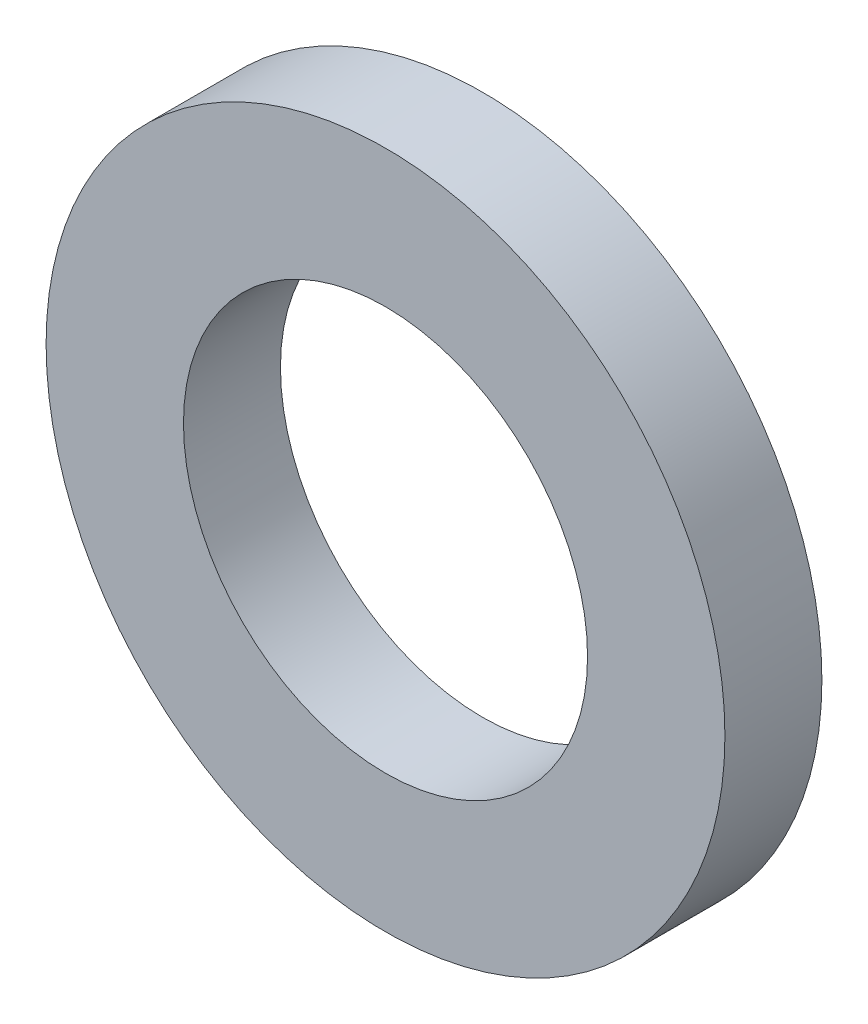
ISO-10303-21;
HEADER;
FILE_DESCRIPTION(('STEP AP214'),'2;1');
FILE_NAME('part.step','',(''),(''),'','','');
FILE_SCHEMA(('AUTOMOTIVE_DESIGN { 1 0 10303 214 1 1 1 1 }'));
ENDSEC;
DATA;
#1=APPLICATION_CONTEXT('core data for automotive mechanical design processes');
#2=APPLICATION_PROTOCOL_DEFINITION('international standard','automotive_design',2000,#1);
#3=PRODUCT_CONTEXT('',#1,'mechanical');
#4=PRODUCT('Part','Part','',(#3));
#5=PRODUCT_RELATED_PRODUCT_CATEGORY('part','',(#4));
#6=PRODUCT_DEFINITION_FORMATION('','',#4);
#7=PRODUCT_DEFINITION_CONTEXT('part definition',#1,'design');
#8=PRODUCT_DEFINITION('design','',#6,#7);
#9=PRODUCT_DEFINITION_SHAPE('','',#8);
#10=(LENGTH_UNIT() NAMED_UNIT(*) SI_UNIT(.MILLI.,.METRE.));
#11=(NAMED_UNIT(*) PLANE_ANGLE_UNIT() SI_UNIT($,.RADIAN.));
#12=(NAMED_UNIT(*) SI_UNIT($,.STERADIAN.) SOLID_ANGLE_UNIT());
#13=UNCERTAINTY_MEASURE_WITH_UNIT(LENGTH_MEASURE(1.E-05),#10,'distance_accuracy_value','');
#14=(GEOMETRIC_REPRESENTATION_CONTEXT(3) GLOBAL_UNCERTAINTY_ASSIGNED_CONTEXT((#13)) GLOBAL_UNIT_ASSIGNED_CONTEXT((#10,
#11,#12)) REPRESENTATION_CONTEXT('',''));
#15=CARTESIAN_POINT('',(0.,0.,0.));
#16=DIRECTION('',(0.,0.,1.));
#17=DIRECTION('',(1.,0.,0.));
#18=AXIS2_PLACEMENT_3D('',#15,#16,#17);
#19=CARTESIAN_POINT('',(0.,0.,6.));
#20=DIRECTION('',(0.,0.,1.));
#21=DIRECTION('',(1.,0.,0.));
#22=AXIS2_PLACEMENT_3D('',#19,#20,#21);
#23=PLANE('',#22);
#24=CARTESIAN_POINT('',(0.,0.,6.));
#25=DIRECTION('',(0.,0.,1.));
#26=DIRECTION('',(1.,0.,0.));
#27=AXIS2_PLACEMENT_3D('',#24,#25,#26);
#28=CIRCLE('',#27,21.);
#29=CARTESIAN_POINT('',(21.,0.,6.));
#30=VERTEX_POINT('',#29);
#31=EDGE_CURVE('E10',#30,#30,#28,.T.);
#32=ORIENTED_EDGE('',*,*,#31,.T.);
#33=EDGE_LOOP('',(#32));
#34=FACE_BOUND('',#33,.T.);
#35=CARTESIAN_POINT('',(0.,0.,6.));
#36=DIRECTION('',(0.,0.,1.));
#37=DIRECTION('',(1.,0.,0.));
#38=AXIS2_PLACEMENT_3D('',#35,#36,#37);
#39=CIRCLE('',#38,12.5);
#40=CARTESIAN_POINT('',(12.5,0.,6.));
#41=VERTEX_POINT('',#40);
#42=EDGE_CURVE('E46',#41,#41,#39,.T.);
#43=ORIENTED_EDGE('',*,*,#42,.F.);
#44=EDGE_LOOP('',(#43));
#45=FACE_BOUND('',#44,.T.);
#46=ADVANCED_FACE('F35',(#34,#45),#23,.T.);
#47=CARTESIAN_POINT('',(0.,0.,0.));
#48=DIRECTION('',(0.,0.,1.));
#49=DIRECTION('',(1.,0.,0.));
#50=AXIS2_PLACEMENT_3D('',#47,#48,#49);
#51=PLANE('',#50);
#52=CARTESIAN_POINT('',(0.,0.,0.));
#53=DIRECTION('',(0.,0.,1.));
#54=DIRECTION('',(1.,0.,0.));
#55=AXIS2_PLACEMENT_3D('',#52,#53,#54);
#56=CIRCLE('',#55,21.);
#57=CARTESIAN_POINT('',(21.,0.,0.));
#58=VERTEX_POINT('',#57);
#59=EDGE_CURVE('E39',#58,#58,#56,.T.);
#60=ORIENTED_EDGE('',*,*,#59,.F.);
#61=EDGE_LOOP('',(#60));
#62=FACE_BOUND('',#61,.T.);
#63=CARTESIAN_POINT('',(0.,0.,0.));
#64=DIRECTION('',(0.,0.,1.));
#65=DIRECTION('',(1.,0.,0.));
#66=AXIS2_PLACEMENT_3D('',#63,#64,#65);
#67=CIRCLE('',#66,12.5);
#68=CARTESIAN_POINT('',(12.5,0.,0.));
#69=VERTEX_POINT('',#68);
#70=EDGE_CURVE('E48',#69,#69,#67,.T.);
#71=ORIENTED_EDGE('',*,*,#70,.T.);
#72=EDGE_LOOP('',(#71));
#73=FACE_BOUND('',#72,.T.);
#74=ADVANCED_FACE('F58',(#62,#73),#51,.F.);
#75=CARTESIAN_POINT('',(0.,0.,6.));
#76=DIRECTION('',(0.,0.,-1.));
#77=DIRECTION('',(-1.,0.,0.));
#78=AXIS2_PLACEMENT_3D('',#75,#76,#77);
#79=CYLINDRICAL_SURFACE('',#78,21.);
#80=ORIENTED_EDGE('',*,*,#31,.F.);
#81=EDGE_LOOP('',(#80));
#82=FACE_BOUND('',#81,.T.);
#83=ORIENTED_EDGE('',*,*,#59,.T.);
#84=EDGE_LOOP('',(#83));
#85=FACE_BOUND('',#84,.T.);
#86=ADVANCED_FACE('F37',(#82,#85),#79,.T.);
#87=CARTESIAN_POINT('',(0.,0.,6.));
#88=DIRECTION('',(0.,0.,-1.));
#89=DIRECTION('',(-1.,0.,0.));
#90=AXIS2_PLACEMENT_3D('',#87,#88,#89);
#91=CYLINDRICAL_SURFACE('',#90,12.5);
#92=ORIENTED_EDGE('',*,*,#42,.T.);
#93=EDGE_LOOP('',(#92));
#94=FACE_BOUND('',#93,.T.);
#95=ORIENTED_EDGE('',*,*,#70,.F.);
#96=EDGE_LOOP('',(#95));
#97=FACE_BOUND('',#96,.T.);
#98=ADVANCED_FACE('F54',(#94,#97),#91,.F.);
#99=CLOSED_SHELL('',(#46,#74,#86,#98));
#100=MANIFOLD_SOLID_BREP('B2',#99);
#101=ADVANCED_BREP_SHAPE_REPRESENTATION('',(#18,#100),#14);
#102=SHAPE_DEFINITION_REPRESENTATION(#9,#101);
ENDSEC;
END-ISO-10303-21;
